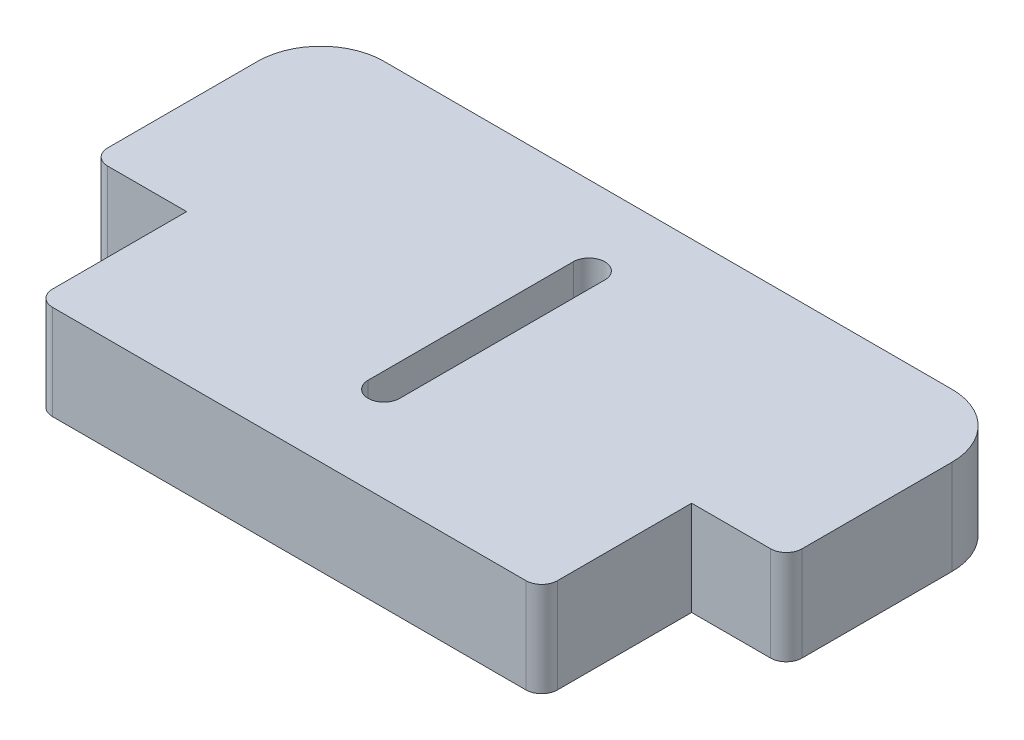
ISO-10303-21;
HEADER;
FILE_DESCRIPTION(('STEP AP214'),'2;1');
FILE_NAME('part.step','',(''),(''),'','','');
FILE_SCHEMA(('AUTOMOTIVE_DESIGN { 1 0 10303 214 1 1 1 1 }'));
ENDSEC;
DATA;
#1=APPLICATION_CONTEXT('core data for automotive mechanical design processes');
#2=APPLICATION_PROTOCOL_DEFINITION('international standard','automotive_design',2000,#1);
#3=PRODUCT_CONTEXT('',#1,'mechanical');
#4=PRODUCT('Part','Part','',(#3));
#5=PRODUCT_RELATED_PRODUCT_CATEGORY('part','',(#4));
#6=PRODUCT_DEFINITION_FORMATION('','',#4);
#7=PRODUCT_DEFINITION_CONTEXT('part definition',#1,'design');
#8=PRODUCT_DEFINITION('design','',#6,#7);
#9=PRODUCT_DEFINITION_SHAPE('','',#8);
#10=(LENGTH_UNIT() NAMED_UNIT(*) SI_UNIT(.MILLI.,.METRE.));
#11=(NAMED_UNIT(*) PLANE_ANGLE_UNIT() SI_UNIT($,.RADIAN.));
#12=(NAMED_UNIT(*) SI_UNIT($,.STERADIAN.) SOLID_ANGLE_UNIT());
#13=UNCERTAINTY_MEASURE_WITH_UNIT(LENGTH_MEASURE(1.E-05),#10,'distance_accuracy_value','');
#14=(GEOMETRIC_REPRESENTATION_CONTEXT(3) GLOBAL_UNCERTAINTY_ASSIGNED_CONTEXT((#13)) GLOBAL_UNIT_ASSIGNED_CONTEXT((#10,
#11,#12)) REPRESENTATION_CONTEXT('',''));
#15=CARTESIAN_POINT('',(0.,0.,0.));
#16=DIRECTION('',(0.,0.,1.));
#17=DIRECTION('',(1.,0.,0.));
#18=AXIS2_PLACEMENT_3D('',#15,#16,#17);
#19=CARTESIAN_POINT('',(0.,3.,-95.6317273998484));
#20=DIRECTION('',(0.,0.,1.));
#21=DIRECTION('',(1.,0.,0.));
#22=AXIS2_PLACEMENT_3D('',#19,#20,#21);
#23=PLANE('',#22);
#24=DIRECTION('',(-1.,0.,0.));
#25=VECTOR('',#24,1.);
#26=CARTESIAN_POINT('',(0.,3.,-95.6317273998484));
#27=LINE('',#26,#25);
#28=CARTESIAN_POINT('',(0.555255474952938,3.,-95.6317273998484));
#29=VERTEX_POINT('',#28);
#30=CARTESIAN_POINT('',(-1.94474452504942,3.,-95.6317273998484));
#31=VERTEX_POINT('',#30);
#32=EDGE_CURVE('E211',#29,#31,#27,.T.);
#33=ORIENTED_EDGE('',*,*,#32,.T.);
#34=DIRECTION('',(0.,-1.,0.));
#35=VECTOR('',#34,1.);
#36=CARTESIAN_POINT('',(-1.94474452504942,3.,-95.6317273998484));
#37=LINE('',#36,#35);
#38=CARTESIAN_POINT('',(-1.94474452504942,0.,-95.6317273998484));
#39=VERTEX_POINT('',#38);
#40=EDGE_CURVE('E320',#31,#39,#37,.T.);
#41=ORIENTED_EDGE('',*,*,#40,.T.);
#42=DIRECTION('',(-1.,0.,0.));
#43=VECTOR('',#42,1.);
#44=CARTESIAN_POINT('',(0.,0.,-95.6317273998484));
#45=LINE('',#44,#43);
#46=CARTESIAN_POINT('',(0.555255474952938,0.,-95.6317273998484));
#47=VERTEX_POINT('',#46);
#48=EDGE_CURVE('E253',#47,#39,#45,.T.);
#49=ORIENTED_EDGE('',*,*,#48,.F.);
#50=DIRECTION('',(0.,-1.,0.));
#51=VECTOR('',#50,1.);
#52=CARTESIAN_POINT('',(0.555255474952938,3.,-95.6317273998484));
#53=LINE('',#52,#51);
#54=EDGE_CURVE('E282',#29,#47,#53,.T.);
#55=ORIENTED_EDGE('',*,*,#54,.F.);
#56=EDGE_LOOP('',(#33,#41,#49,#55));
#57=FACE_BOUND('',#56,.T.);
#58=ADVANCED_FACE('F45',(#57),#23,.T.);
#59=CARTESIAN_POINT('',(0.555255474952947,3.,0.));
#60=DIRECTION('',(1.,0.,0.));
#61=DIRECTION('',(0.,0.,-1.));
#62=AXIS2_PLACEMENT_3D('',#59,#60,#61);
#63=PLANE('',#62);
#64=DIRECTION('',(0.,0.,1.));
#65=VECTOR('',#64,1.);
#66=CARTESIAN_POINT('',(0.555255474952947,0.,0.));
#67=LINE('',#66,#65);
#68=CARTESIAN_POINT('',(0.555255474952938,0.,-91.3817273998484));
#69=VERTEX_POINT('',#68);
#70=EDGE_CURVE('E257',#47,#69,#67,.T.);
#71=ORIENTED_EDGE('',*,*,#70,.T.);
#72=DIRECTION('',(0.,-1.,0.));
#73=VECTOR('',#72,1.);
#74=CARTESIAN_POINT('',(0.555255474952938,3.,-91.3817273998484));
#75=LINE('',#74,#73);
#76=CARTESIAN_POINT('',(0.555255474952938,3.,-91.3817273998484));
#77=VERTEX_POINT('',#76);
#78=EDGE_CURVE('E11',#69,#77,#75,.F.);
#79=ORIENTED_EDGE('',*,*,#78,.T.);
#80=DIRECTION('',(0.,0.,1.));
#81=VECTOR('',#80,1.);
#82=CARTESIAN_POINT('',(0.555255474952947,3.,0.));
#83=LINE('',#82,#81);
#84=EDGE_CURVE('E215',#29,#77,#83,.T.);
#85=ORIENTED_EDGE('',*,*,#84,.F.);
#86=ORIENTED_EDGE('',*,*,#54,.T.);
#87=EDGE_LOOP('',(#71,#79,#85,#86));
#88=FACE_BOUND('',#87,.T.);
#89=ADVANCED_FACE('F417',(#88),#63,.F.);
#90=CARTESIAN_POINT('',(0.,3.,-90.8817273998484));
#91=DIRECTION('',(0.,0.,1.));
#92=DIRECTION('',(1.,0.,0.));
#93=AXIS2_PLACEMENT_3D('',#90,#91,#92);
#94=PLANE('',#93);
#95=DIRECTION('',(-1.,0.,0.));
#96=VECTOR('',#95,1.);
#97=CARTESIAN_POINT('',(0.,0.,-90.8817273998484));
#98=LINE('',#97,#96);
#99=CARTESIAN_POINT('',(16.0552554749529,0.,-90.8817273998484));
#100=VERTEX_POINT('',#99);
#101=CARTESIAN_POINT('',(1.05525547495294,0.,-90.8817273998484));
#102=VERTEX_POINT('',#101);
#103=EDGE_CURVE('E261',#100,#102,#98,.T.);
#104=ORIENTED_EDGE('',*,*,#103,.F.);
#105=DIRECTION('',(0.,-1.,0.));
#106=VECTOR('',#105,1.);
#107=CARTESIAN_POINT('',(16.0552554749529,3.,-90.8817273998484));
#108=LINE('',#107,#106);
#109=CARTESIAN_POINT('',(16.0552554749529,3.,-90.8817273998484));
#110=VERTEX_POINT('',#109);
#111=EDGE_CURVE('E54',#100,#110,#108,.F.);
#112=ORIENTED_EDGE('',*,*,#111,.T.);
#113=DIRECTION('',(-1.,0.,0.));
#114=VECTOR('',#113,1.);
#115=CARTESIAN_POINT('',(0.,3.,-90.8817273998484));
#116=LINE('',#115,#114);
#117=CARTESIAN_POINT('',(1.05525547495294,3.,-90.8817273998484));
#118=VERTEX_POINT('',#117);
#119=EDGE_CURVE('E219',#110,#118,#116,.T.);
#120=ORIENTED_EDGE('',*,*,#119,.T.);
#121=DIRECTION('',(0.,-1.,0.));
#122=VECTOR('',#121,1.);
#123=CARTESIAN_POINT('',(1.05525547495294,0.,-90.8817273998484));
#124=LINE('',#123,#122);
#125=EDGE_CURVE('E360',#118,#102,#124,.T.);
#126=ORIENTED_EDGE('',*,*,#125,.T.);
#127=EDGE_LOOP('',(#104,#112,#120,#126));
#128=FACE_BOUND('',#127,.T.);
#129=ADVANCED_FACE('F367',(#128),#94,.T.);
#130=CARTESIAN_POINT('',(16.5552554749529,3.,0.));
#131=DIRECTION('',(1.,0.,0.));
#132=DIRECTION('',(0.,0.,-1.));
#133=AXIS2_PLACEMENT_3D('',#130,#131,#132);
#134=PLANE('',#133);
#135=DIRECTION('',(0.,0.,1.));
#136=VECTOR('',#135,1.);
#137=CARTESIAN_POINT('',(16.5552554749529,3.,0.));
#138=LINE('',#137,#136);
#139=CARTESIAN_POINT('',(16.5552554749529,3.,-95.6317273998484));
#140=VERTEX_POINT('',#139);
#141=CARTESIAN_POINT('',(16.5552554749529,3.,-91.3817273998484));
#142=VERTEX_POINT('',#141);
#143=EDGE_CURVE('E223',#140,#142,#138,.T.);
#144=ORIENTED_EDGE('',*,*,#143,.T.);
#145=DIRECTION('',(0.,-1.,0.));
#146=VECTOR('',#145,1.);
#147=CARTESIAN_POINT('',(16.5552554749529,3.,-91.3817273998484));
#148=LINE('',#147,#146);
#149=CARTESIAN_POINT('',(16.5552554749529,0.,-91.3817273998484));
#150=VERTEX_POINT('',#149);
#151=EDGE_CURVE('E356',#142,#150,#148,.T.);
#152=ORIENTED_EDGE('',*,*,#151,.T.);
#153=DIRECTION('',(0.,0.,1.));
#154=VECTOR('',#153,1.);
#155=CARTESIAN_POINT('',(16.5552554749529,0.,0.));
#156=LINE('',#155,#154);
#157=CARTESIAN_POINT('',(16.5552554749529,0.,-95.6317273998484));
#158=VERTEX_POINT('',#157);
#159=EDGE_CURVE('E265',#158,#150,#156,.T.);
#160=ORIENTED_EDGE('',*,*,#159,.F.);
#161=DIRECTION('',(0.,-1.,0.));
#162=VECTOR('',#161,1.);
#163=CARTESIAN_POINT('',(16.5552554749529,3.,-95.6317273998484));
#164=LINE('',#163,#162);
#165=EDGE_CURVE('E185',#140,#158,#164,.T.);
#166=ORIENTED_EDGE('',*,*,#165,.F.);
#167=EDGE_LOOP('',(#144,#152,#160,#166));
#168=FACE_BOUND('',#167,.T.);
#169=ADVANCED_FACE('F376',(#168),#134,.T.);
#170=CARTESIAN_POINT('',(0.,3.,-95.6317273998484));
#171=DIRECTION('',(0.,0.,-1.));
#172=DIRECTION('',(-1.,0.,0.));
#173=AXIS2_PLACEMENT_3D('',#170,#171,#172);
#174=PLANE('',#173);
#175=DIRECTION('',(1.,0.,0.));
#176=VECTOR('',#175,1.);
#177=CARTESIAN_POINT('',(0.,0.,-95.6317273998484));
#178=LINE('',#177,#176);
#179=CARTESIAN_POINT('',(19.0552554749506,0.,-95.6317273998484));
#180=VERTEX_POINT('',#179);
#181=EDGE_CURVE('E269',#158,#180,#178,.T.);
#182=ORIENTED_EDGE('',*,*,#181,.T.);
#183=DIRECTION('',(0.,-1.,0.));
#184=VECTOR('',#183,1.);
#185=CARTESIAN_POINT('',(19.0552554749506,3.,-95.6317273998484));
#186=LINE('',#185,#184);
#187=CARTESIAN_POINT('',(19.0552554749506,3.,-95.6317273998484));
#188=VERTEX_POINT('',#187);
#189=EDGE_CURVE('E61',#180,#188,#186,.F.);
#190=ORIENTED_EDGE('',*,*,#189,.T.);
#191=DIRECTION('',(1.,0.,0.));
#192=VECTOR('',#191,1.);
#193=CARTESIAN_POINT('',(0.,3.,-95.6317273998484));
#194=LINE('',#193,#192);
#195=EDGE_CURVE('E226',#140,#188,#194,.T.);
#196=ORIENTED_EDGE('',*,*,#195,.F.);
#197=ORIENTED_EDGE('',*,*,#165,.T.);
#198=EDGE_LOOP('',(#182,#190,#196,#197));
#199=FACE_BOUND('',#198,.T.);
#200=ADVANCED_FACE('F381',(#199),#174,.F.);
#201=CARTESIAN_POINT('',(19.5552554749506,3.,0.));
#202=DIRECTION('',(-1.,0.,0.));
#203=DIRECTION('',(0.,0.,1.));
#204=AXIS2_PLACEMENT_3D('',#201,#202,#203);
#205=PLANE('',#204);
#206=DIRECTION('',(0.,0.,-1.));
#207=VECTOR('',#206,1.);
#208=CARTESIAN_POINT('',(19.5552554749506,3.,0.));
#209=LINE('',#208,#207);
#210=CARTESIAN_POINT('',(19.5552554749506,3.,-96.1317273998484));
#211=VERTEX_POINT('',#210);
#212=CARTESIAN_POINT('',(19.5552554749506,3.,-100.881727399848));
#213=VERTEX_POINT('',#212);
#214=EDGE_CURVE('E229',#211,#213,#209,.T.);
#215=ORIENTED_EDGE('',*,*,#214,.F.);
#216=DIRECTION('',(0.,-1.,0.));
#217=VECTOR('',#216,1.);
#218=CARTESIAN_POINT('',(19.5552554749506,3.,-96.1317273998484));
#219=LINE('',#218,#217);
#220=CARTESIAN_POINT('',(19.5552554749506,0.,-96.1317273998484));
#221=VERTEX_POINT('',#220);
#222=EDGE_CURVE('E350',#211,#221,#219,.T.);
#223=ORIENTED_EDGE('',*,*,#222,.T.);
#224=DIRECTION('',(0.,0.,-1.));
#225=VECTOR('',#224,1.);
#226=CARTESIAN_POINT('',(19.5552554749506,0.,0.));
#227=LINE('',#226,#225);
#228=CARTESIAN_POINT('',(19.5552554749506,0.,-100.881727399848));
#229=VERTEX_POINT('',#228);
#230=EDGE_CURVE('E272',#221,#229,#227,.T.);
#231=ORIENTED_EDGE('',*,*,#230,.T.);
#232=DIRECTION('',(0.,-1.,0.));
#233=VECTOR('',#232,1.);
#234=CARTESIAN_POINT('',(19.5552554749506,3.,-100.881727399848));
#235=LINE('',#234,#233);
#236=EDGE_CURVE('E306',#229,#213,#235,.F.);
#237=ORIENTED_EDGE('',*,*,#236,.T.);
#238=EDGE_LOOP('',(#215,#223,#231,#237));
#239=FACE_BOUND('',#238,.T.);
#240=ADVANCED_FACE('F388',(#239),#205,.F.);
#241=CARTESIAN_POINT('',(0.,3.,-102.881727399848));
#242=DIRECTION('',(0.,0.,1.));
#243=DIRECTION('',(1.,0.,0.));
#244=AXIS2_PLACEMENT_3D('',#241,#242,#243);
#245=PLANE('',#244);
#246=DIRECTION('',(-1.,0.,0.));
#247=VECTOR('',#246,1.);
#248=CARTESIAN_POINT('',(0.,3.,-102.881727399848));
#249=LINE('',#248,#247);
#250=CARTESIAN_POINT('',(17.5552554749506,3.,-102.881727399848));
#251=VERTEX_POINT('',#250);
#252=CARTESIAN_POINT('',(-0.444744525049419,3.,-102.881727399848));
#253=VERTEX_POINT('',#252);
#254=EDGE_CURVE('E232',#251,#253,#249,.T.);
#255=ORIENTED_EDGE('',*,*,#254,.F.);
#256=DIRECTION('',(0.,-1.,0.));
#257=VECTOR('',#256,1.);
#258=CARTESIAN_POINT('',(17.5552554749506,3.,-102.881727399848));
#259=LINE('',#258,#257);
#260=CARTESIAN_POINT('',(17.5552554749506,0.,-102.881727399848));
#261=VERTEX_POINT('',#260);
#262=EDGE_CURVE('E295',#251,#261,#259,.T.);
#263=ORIENTED_EDGE('',*,*,#262,.T.);
#264=DIRECTION('',(-1.,0.,0.));
#265=VECTOR('',#264,1.);
#266=CARTESIAN_POINT('',(0.,0.,-102.881727399848));
#267=LINE('',#266,#265);
#268=CARTESIAN_POINT('',(-0.444744525049419,0.,-102.881727399848));
#269=VERTEX_POINT('',#268);
#270=EDGE_CURVE('E275',#261,#269,#267,.T.);
#271=ORIENTED_EDGE('',*,*,#270,.T.);
#272=DIRECTION('',(0.,-1.,0.));
#273=VECTOR('',#272,1.);
#274=CARTESIAN_POINT('',(-0.444744525049419,3.,-102.881727399848));
#275=LINE('',#274,#273);
#276=EDGE_CURVE('E285',#269,#253,#275,.F.);
#277=ORIENTED_EDGE('',*,*,#276,.T.);
#278=EDGE_LOOP('',(#255,#263,#271,#277));
#279=FACE_BOUND('',#278,.T.);
#280=ADVANCED_FACE('F397',(#279),#245,.F.);
#281=CARTESIAN_POINT('',(8.55525547495058,3.,-93.8817273998484));
#282=DIRECTION('',(0.,-1.,0.));
#283=DIRECTION('',(0.,0.,-1.));
#284=AXIS2_PLACEMENT_3D('',#281,#282,#283);
#285=CYLINDRICAL_SURFACE('',#284,0.5);
#286=CARTESIAN_POINT('',(8.55525547495058,0.,-93.8817273998484));
#287=DIRECTION('',(0.,1.,0.));
#288=DIRECTION('',(0.,0.,1.));
#289=AXIS2_PLACEMENT_3D('',#286,#287,#288);
#290=CIRCLE('',#289,0.5);
#291=CARTESIAN_POINT('',(8.05525547495058,0.,-93.8817273998484));
#292=VERTEX_POINT('',#291);
#293=CARTESIAN_POINT('',(9.05525547495058,0.,-93.8817273998484));
#294=VERTEX_POINT('',#293);
#295=EDGE_CURVE('E179',#292,#294,#290,.T.);
#296=ORIENTED_EDGE('',*,*,#295,.F.);
#297=DIRECTION('',(0.,-1.,0.));
#298=VECTOR('',#297,1.);
#299=CARTESIAN_POINT('',(8.05525547495058,3.,-93.8817273998484));
#300=LINE('',#299,#298);
#301=CARTESIAN_POINT('',(8.05525547495058,3.,-93.8817273998484));
#302=VERTEX_POINT('',#301);
#303=EDGE_CURVE('E174',#302,#292,#300,.T.);
#304=ORIENTED_EDGE('',*,*,#303,.F.);
#305=CARTESIAN_POINT('',(8.55525547495058,3.,-93.8817273998484));
#306=DIRECTION('',(0.,1.,0.));
#307=DIRECTION('',(0.,0.,1.));
#308=AXIS2_PLACEMENT_3D('',#305,#306,#307);
#309=CIRCLE('',#308,0.5);
#310=CARTESIAN_POINT('',(9.05525547495058,3.,-93.8817273998484));
#311=VERTEX_POINT('',#310);
#312=EDGE_CURVE('E177',#302,#311,#309,.T.);
#313=ORIENTED_EDGE('',*,*,#312,.T.);
#314=DIRECTION('',(0.,-1.,0.));
#315=VECTOR('',#314,1.);
#316=CARTESIAN_POINT('',(9.05525547495058,3.,-93.8817273998484));
#317=LINE('',#316,#315);
#318=EDGE_CURVE('E239',#311,#294,#317,.T.);
#319=ORIENTED_EDGE('',*,*,#318,.T.);
#320=EDGE_LOOP('',(#296,#304,#313,#319));
#321=FACE_BOUND('',#320,.T.);
#322=ADVANCED_FACE('F176',(#321),#285,.F.);
#323=CARTESIAN_POINT('',(8.0552554749506,3.,0.));
#324=DIRECTION('',(1.,0.,0.));
#325=DIRECTION('',(0.,0.,-1.));
#326=AXIS2_PLACEMENT_3D('',#323,#324,#325);
#327=PLANE('',#326);
#328=DIRECTION('',(0.,0.,1.));
#329=VECTOR('',#328,1.);
#330=CARTESIAN_POINT('',(8.0552554749506,0.,0.));
#331=LINE('',#330,#329);
#332=CARTESIAN_POINT('',(8.05525547495058,0.,-100.381727399848));
#333=VERTEX_POINT('',#332);
#334=EDGE_CURVE('E242',#333,#292,#331,.T.);
#335=ORIENTED_EDGE('',*,*,#334,.F.);
#336=DIRECTION('',(0.,-1.,0.));
#337=VECTOR('',#336,1.);
#338=CARTESIAN_POINT('',(8.05525547495058,3.,-100.381727399848));
#339=LINE('',#338,#337);
#340=CARTESIAN_POINT('',(8.05525547495058,3.,-100.381727399848));
#341=VERTEX_POINT('',#340);
#342=EDGE_CURVE('E186',#341,#333,#339,.T.);
#343=ORIENTED_EDGE('',*,*,#342,.F.);
#344=DIRECTION('',(0.,0.,1.));
#345=VECTOR('',#344,1.);
#346=CARTESIAN_POINT('',(8.0552554749506,3.,0.));
#347=LINE('',#346,#345);
#348=EDGE_CURVE('E192',#341,#302,#347,.T.);
#349=ORIENTED_EDGE('',*,*,#348,.T.);
#350=ORIENTED_EDGE('',*,*,#303,.T.);
#351=EDGE_LOOP('',(#335,#343,#349,#350));
#352=FACE_BOUND('',#351,.T.);
#353=ADVANCED_FACE('F200',(#352),#327,.T.);
#354=CARTESIAN_POINT('',(8.55525547495058,3.,-100.381727399848));
#355=DIRECTION('',(0.,-1.,0.));
#356=DIRECTION('',(0.,0.,-1.));
#357=AXIS2_PLACEMENT_3D('',#354,#355,#356);
#358=CYLINDRICAL_SURFACE('',#357,0.500000000000001);
#359=CARTESIAN_POINT('',(8.55525547495058,0.,-100.381727399848));
#360=DIRECTION('',(0.,1.,0.));
#361=DIRECTION('',(0.,0.,1.));
#362=AXIS2_PLACEMENT_3D('',#359,#360,#361);
#363=CIRCLE('',#362,0.500000000000001);
#364=CARTESIAN_POINT('',(9.05525547495058,0.,-100.381727399848));
#365=VERTEX_POINT('',#364);
#366=EDGE_CURVE('E245',#365,#333,#363,.T.);
#367=ORIENTED_EDGE('',*,*,#366,.F.);
#368=DIRECTION('',(0.,-1.,0.));
#369=VECTOR('',#368,1.);
#370=CARTESIAN_POINT('',(9.05525547495058,3.,-100.381727399848));
#371=LINE('',#370,#369);
#372=CARTESIAN_POINT('',(9.05525547495058,3.,-100.381727399848));
#373=VERTEX_POINT('',#372);
#374=EDGE_CURVE('E288',#373,#365,#371,.T.);
#375=ORIENTED_EDGE('',*,*,#374,.F.);
#376=CARTESIAN_POINT('',(8.55525547495058,3.,-100.381727399848));
#377=DIRECTION('',(0.,1.,0.));
#378=DIRECTION('',(0.,0.,1.));
#379=AXIS2_PLACEMENT_3D('',#376,#377,#378);
#380=CIRCLE('',#379,0.500000000000001);
#381=EDGE_CURVE('E202',#373,#341,#380,.T.);
#382=ORIENTED_EDGE('',*,*,#381,.T.);
#383=ORIENTED_EDGE('',*,*,#342,.T.);
#384=EDGE_LOOP('',(#367,#375,#382,#383));
#385=FACE_BOUND('',#384,.T.);
#386=ADVANCED_FACE('F434',(#385),#358,.F.);
#387=CARTESIAN_POINT('',(9.05525547495058,3.,0.));
#388=DIRECTION('',(1.,0.,0.));
#389=DIRECTION('',(0.,0.,-1.));
#390=AXIS2_PLACEMENT_3D('',#387,#388,#389);
#391=PLANE('',#390);
#392=DIRECTION('',(0.,0.,1.));
#393=VECTOR('',#392,1.);
#394=CARTESIAN_POINT('',(9.05525547495058,0.,0.));
#395=LINE('',#394,#393);
#396=EDGE_CURVE('E249',#365,#294,#395,.T.);
#397=ORIENTED_EDGE('',*,*,#396,.T.);
#398=ORIENTED_EDGE('',*,*,#318,.F.);
#399=DIRECTION('',(0.,0.,1.));
#400=VECTOR('',#399,1.);
#401=CARTESIAN_POINT('',(9.05525547495058,3.,0.));
#402=LINE('',#401,#400);
#403=EDGE_CURVE('E195',#373,#311,#402,.T.);
#404=ORIENTED_EDGE('',*,*,#403,.F.);
#405=ORIENTED_EDGE('',*,*,#374,.T.);
#406=EDGE_LOOP('',(#397,#398,#404,#405));
#407=FACE_BOUND('',#406,.T.);
#408=ADVANCED_FACE('F430',(#407),#391,.F.);
#409=CARTESIAN_POINT('',(-2.44474452504942,3.,0.));
#410=DIRECTION('',(-1.,0.,0.));
#411=DIRECTION('',(0.,0.,1.));
#412=AXIS2_PLACEMENT_3D('',#409,#410,#411);
#413=PLANE('',#412);
#414=DIRECTION('',(0.,0.,-1.));
#415=VECTOR('',#414,1.);
#416=CARTESIAN_POINT('',(-2.44474452504942,0.,0.));
#417=LINE('',#416,#415);
#418=CARTESIAN_POINT('',(-2.44474452504942,0.,-96.1317273998484));
#419=VERTEX_POINT('',#418);
#420=CARTESIAN_POINT('',(-2.44474452504942,0.,-100.881727399848));
#421=VERTEX_POINT('',#420);
#422=EDGE_CURVE('E198',#419,#421,#417,.T.);
#423=ORIENTED_EDGE('',*,*,#422,.F.);
#424=DIRECTION('',(0.,-1.,0.));
#425=VECTOR('',#424,1.);
#426=CARTESIAN_POINT('',(-2.44474452504942,3.,-96.1317273998484));
#427=LINE('',#426,#425);
#428=CARTESIAN_POINT('',(-2.44474452504942,3.,-96.1317273998484));
#429=VERTEX_POINT('',#428);
#430=EDGE_CURVE('E336',#419,#429,#427,.F.);
#431=ORIENTED_EDGE('',*,*,#430,.T.);
#432=DIRECTION('',(0.,0.,-1.));
#433=VECTOR('',#432,1.);
#434=CARTESIAN_POINT('',(-2.44474452504942,3.,0.));
#435=LINE('',#434,#433);
#436=CARTESIAN_POINT('',(-2.44474452504942,3.,-100.881727399848));
#437=VERTEX_POINT('',#436);
#438=EDGE_CURVE('E236',#429,#437,#435,.T.);
#439=ORIENTED_EDGE('',*,*,#438,.T.);
#440=DIRECTION('',(0.,-1.,0.));
#441=VECTOR('',#440,1.);
#442=CARTESIAN_POINT('',(-2.44474452504942,0.,-100.881727399848));
#443=LINE('',#442,#441);
#444=EDGE_CURVE('E316',#437,#421,#443,.T.);
#445=ORIENTED_EDGE('',*,*,#444,.T.);
#446=EDGE_LOOP('',(#423,#431,#439,#445));
#447=FACE_BOUND('',#446,.T.);
#448=ADVANCED_FACE('F433',(#447),#413,.T.);
#449=CARTESIAN_POINT('',(0.,3.,0.));
#450=DIRECTION('',(0.,1.,0.));
#451=DIRECTION('',(0.,0.,1.));
#452=AXIS2_PLACEMENT_3D('',#449,#450,#451);
#453=PLANE('',#452);
#454=ORIENTED_EDGE('',*,*,#312,.F.);
#455=ORIENTED_EDGE('',*,*,#348,.F.);
#456=ORIENTED_EDGE('',*,*,#381,.F.);
#457=ORIENTED_EDGE('',*,*,#403,.T.);
#458=EDGE_LOOP('',(#454,#455,#456,#457));
#459=FACE_BOUND('',#458,.T.);
#460=ORIENTED_EDGE('',*,*,#438,.F.);
#461=CARTESIAN_POINT('',(-1.94474452504942,3.,-96.1317273998484));
#462=DIRECTION('',(0.,1.,0.));
#463=DIRECTION('',(0.,0.,1.));
#464=AXIS2_PLACEMENT_3D('',#461,#462,#463);
#465=CIRCLE('',#464,0.5);
#466=EDGE_CURVE('E347',#429,#31,#465,.T.);
#467=ORIENTED_EDGE('',*,*,#466,.T.);
#468=ORIENTED_EDGE('',*,*,#32,.F.);
#469=ORIENTED_EDGE('',*,*,#84,.T.);
#470=CARTESIAN_POINT('',(1.05525547495294,3.,-91.3817273998484));
#471=DIRECTION('',(0.,1.,0.));
#472=DIRECTION('',(0.,0.,1.));
#473=AXIS2_PLACEMENT_3D('',#470,#471,#472);
#474=CIRCLE('',#473,0.5);
#475=EDGE_CURVE('E339',#77,#118,#474,.T.);
#476=ORIENTED_EDGE('',*,*,#475,.T.);
#477=ORIENTED_EDGE('',*,*,#119,.F.);
#478=CARTESIAN_POINT('',(16.0552554749529,3.,-91.3817273998484));
#479=DIRECTION('',(0.,1.,0.));
#480=DIRECTION('',(0.,0.,1.));
#481=AXIS2_PLACEMENT_3D('',#478,#479,#480);
#482=CIRCLE('',#481,0.5);
#483=EDGE_CURVE('E69',#110,#142,#482,.T.);
#484=ORIENTED_EDGE('',*,*,#483,.T.);
#485=ORIENTED_EDGE('',*,*,#143,.F.);
#486=ORIENTED_EDGE('',*,*,#195,.T.);
#487=CARTESIAN_POINT('',(19.0552554749506,3.,-96.1317273998484));
#488=DIRECTION('',(0.,1.,0.));
#489=DIRECTION('',(0.,0.,1.));
#490=AXIS2_PLACEMENT_3D('',#487,#488,#489);
#491=CIRCLE('',#490,0.5);
#492=EDGE_CURVE('E344',#188,#211,#491,.T.);
#493=ORIENTED_EDGE('',*,*,#492,.T.);
#494=ORIENTED_EDGE('',*,*,#214,.T.);
#495=CARTESIAN_POINT('',(17.5552554749506,3.,-100.881727399848));
#496=DIRECTION('',(0.,1.,0.));
#497=DIRECTION('',(0.,0.,1.));
#498=AXIS2_PLACEMENT_3D('',#495,#496,#497);
#499=CIRCLE('',#498,2.);
#500=EDGE_CURVE('E314',#213,#251,#499,.T.);
#501=ORIENTED_EDGE('',*,*,#500,.T.);
#502=ORIENTED_EDGE('',*,*,#254,.T.);
#503=CARTESIAN_POINT('',(-0.444744525049419,3.,-100.881727399848));
#504=DIRECTION('',(0.,1.,0.));
#505=DIRECTION('',(0.,0.,1.));
#506=AXIS2_PLACEMENT_3D('',#503,#504,#505);
#507=CIRCLE('',#506,2.);
#508=EDGE_CURVE('E310',#253,#437,#507,.T.);
#509=ORIENTED_EDGE('',*,*,#508,.T.);
#510=EDGE_LOOP('',(#460,#467,#468,#469,#476,#477,#484,#485,#486,#493,#494,#501,#502,#509));
#511=FACE_BOUND('',#510,.T.);
#512=ADVANCED_FACE('F190',(#459,#511),#453,.T.);
#513=CARTESIAN_POINT('',(0.,0.,0.));
#514=DIRECTION('',(0.,1.,0.));
#515=DIRECTION('',(0.,0.,1.));
#516=AXIS2_PLACEMENT_3D('',#513,#514,#515);
#517=PLANE('',#516);
#518=ORIENTED_EDGE('',*,*,#295,.T.);
#519=ORIENTED_EDGE('',*,*,#396,.F.);
#520=ORIENTED_EDGE('',*,*,#366,.T.);
#521=ORIENTED_EDGE('',*,*,#334,.T.);
#522=EDGE_LOOP('',(#518,#519,#520,#521));
#523=FACE_BOUND('',#522,.T.);
#524=ORIENTED_EDGE('',*,*,#48,.T.);
#525=CARTESIAN_POINT('',(-1.94474452504942,0.,-96.1317273998484));
#526=DIRECTION('',(0.,1.,0.));
#527=DIRECTION('',(0.,0.,1.));
#528=AXIS2_PLACEMENT_3D('',#525,#526,#527);
#529=CIRCLE('',#528,0.5);
#530=EDGE_CURVE('E333',#39,#419,#529,.F.);
#531=ORIENTED_EDGE('',*,*,#530,.T.);
#532=ORIENTED_EDGE('',*,*,#422,.T.);
#533=CARTESIAN_POINT('',(-0.444744525049419,0.,-100.881727399848));
#534=DIRECTION('',(0.,1.,0.));
#535=DIRECTION('',(0.,0.,1.));
#536=AXIS2_PLACEMENT_3D('',#533,#534,#535);
#537=CIRCLE('',#536,2.);
#538=EDGE_CURVE('E299',#421,#269,#537,.F.);
#539=ORIENTED_EDGE('',*,*,#538,.T.);
#540=ORIENTED_EDGE('',*,*,#270,.F.);
#541=CARTESIAN_POINT('',(17.5552554749506,0.,-100.881727399848));
#542=DIRECTION('',(0.,1.,0.));
#543=DIRECTION('',(0.,0.,1.));
#544=AXIS2_PLACEMENT_3D('',#541,#542,#543);
#545=CIRCLE('',#544,2.);
#546=EDGE_CURVE('E302',#261,#229,#545,.F.);
#547=ORIENTED_EDGE('',*,*,#546,.T.);
#548=ORIENTED_EDGE('',*,*,#230,.F.);
#549=CARTESIAN_POINT('',(19.0552554749506,0.,-96.1317273998484));
#550=DIRECTION('',(0.,1.,0.));
#551=DIRECTION('',(0.,0.,1.));
#552=AXIS2_PLACEMENT_3D('',#549,#550,#551);
#553=CIRCLE('',#552,0.5);
#554=EDGE_CURVE('E330',#221,#180,#553,.F.);
#555=ORIENTED_EDGE('',*,*,#554,.T.);
#556=ORIENTED_EDGE('',*,*,#181,.F.);
#557=ORIENTED_EDGE('',*,*,#159,.T.);
#558=CARTESIAN_POINT('',(16.0552554749529,0.,-91.3817273998484));
#559=DIRECTION('',(0.,1.,0.));
#560=DIRECTION('',(0.,0.,1.));
#561=AXIS2_PLACEMENT_3D('',#558,#559,#560);
#562=CIRCLE('',#561,0.5);
#563=EDGE_CURVE('E327',#150,#100,#562,.F.);
#564=ORIENTED_EDGE('',*,*,#563,.T.);
#565=ORIENTED_EDGE('',*,*,#103,.T.);
#566=CARTESIAN_POINT('',(1.05525547495294,0.,-91.3817273998484));
#567=DIRECTION('',(0.,1.,0.));
#568=DIRECTION('',(0.,0.,1.));
#569=AXIS2_PLACEMENT_3D('',#566,#567,#568);
#570=CIRCLE('',#569,0.5);
#571=EDGE_CURVE('E324',#102,#69,#570,.F.);
#572=ORIENTED_EDGE('',*,*,#571,.T.);
#573=ORIENTED_EDGE('',*,*,#70,.F.);
#574=EDGE_LOOP('',(#524,#531,#532,#539,#540,#547,#548,#555,#556,#557,#564,#565,#572,#573));
#575=FACE_BOUND('',#574,.T.);
#576=ADVANCED_FACE('F379',(#523,#575),#517,.F.);
#577=CARTESIAN_POINT('',(17.5552554749506,3.,-100.881727399848));
#578=DIRECTION('',(0.,-1.,0.));
#579=DIRECTION('',(0.,0.,-1.));
#580=AXIS2_PLACEMENT_3D('',#577,#578,#579);
#581=CYLINDRICAL_SURFACE('',#580,2.);
#582=ORIENTED_EDGE('',*,*,#500,.F.);
#583=ORIENTED_EDGE('',*,*,#236,.F.);
#584=ORIENTED_EDGE('',*,*,#546,.F.);
#585=ORIENTED_EDGE('',*,*,#262,.F.);
#586=EDGE_LOOP('',(#582,#583,#584,#585));
#587=FACE_BOUND('',#586,.T.);
#588=ADVANCED_FACE('F393',(#587),#581,.T.);
#589=CARTESIAN_POINT('',(-0.444744525049419,3.,-100.881727399848));
#590=DIRECTION('',(0.,1.,0.));
#591=DIRECTION('',(0.,0.,1.));
#592=AXIS2_PLACEMENT_3D('',#589,#590,#591);
#593=CYLINDRICAL_SURFACE('',#592,2.);
#594=ORIENTED_EDGE('',*,*,#508,.F.);
#595=ORIENTED_EDGE('',*,*,#276,.F.);
#596=ORIENTED_EDGE('',*,*,#538,.F.);
#597=ORIENTED_EDGE('',*,*,#444,.F.);
#598=EDGE_LOOP('',(#594,#595,#596,#597));
#599=FACE_BOUND('',#598,.T.);
#600=ADVANCED_FACE('F402',(#599),#593,.T.);
#601=CARTESIAN_POINT('',(-1.94474452504942,3.,-96.1317273998484));
#602=DIRECTION('',(0.,-1.,0.));
#603=DIRECTION('',(0.,0.,-1.));
#604=AXIS2_PLACEMENT_3D('',#601,#602,#603);
#605=CYLINDRICAL_SURFACE('',#604,0.5);
#606=ORIENTED_EDGE('',*,*,#466,.F.);
#607=ORIENTED_EDGE('',*,*,#430,.F.);
#608=ORIENTED_EDGE('',*,*,#530,.F.);
#609=ORIENTED_EDGE('',*,*,#40,.F.);
#610=EDGE_LOOP('',(#606,#607,#608,#609));
#611=FACE_BOUND('',#610,.T.);
#612=ADVANCED_FACE('F410',(#611),#605,.T.);
#613=CARTESIAN_POINT('',(19.0552554749506,3.,-96.1317273998484));
#614=DIRECTION('',(0.,-1.,0.));
#615=DIRECTION('',(0.,0.,-1.));
#616=AXIS2_PLACEMENT_3D('',#613,#614,#615);
#617=CYLINDRICAL_SURFACE('',#616,0.5);
#618=ORIENTED_EDGE('',*,*,#492,.F.);
#619=ORIENTED_EDGE('',*,*,#189,.F.);
#620=ORIENTED_EDGE('',*,*,#554,.F.);
#621=ORIENTED_EDGE('',*,*,#222,.F.);
#622=EDGE_LOOP('',(#618,#619,#620,#621));
#623=FACE_BOUND('',#622,.T.);
#624=ADVANCED_FACE('F384',(#623),#617,.T.);
#625=CARTESIAN_POINT('',(16.0552554749529,3.,-91.3817273998484));
#626=DIRECTION('',(0.,-1.,0.));
#627=DIRECTION('',(0.,0.,-1.));
#628=AXIS2_PLACEMENT_3D('',#625,#626,#627);
#629=CYLINDRICAL_SURFACE('',#628,0.5);
#630=ORIENTED_EDGE('',*,*,#483,.F.);
#631=ORIENTED_EDGE('',*,*,#111,.F.);
#632=ORIENTED_EDGE('',*,*,#563,.F.);
#633=ORIENTED_EDGE('',*,*,#151,.F.);
#634=EDGE_LOOP('',(#630,#631,#632,#633));
#635=FACE_BOUND('',#634,.T.);
#636=ADVANCED_FACE('F373',(#635),#629,.T.);
#637=CARTESIAN_POINT('',(1.05525547495294,3.,-91.3817273998484));
#638=DIRECTION('',(0.,1.,0.));
#639=DIRECTION('',(0.,0.,1.));
#640=AXIS2_PLACEMENT_3D('',#637,#638,#639);
#641=CYLINDRICAL_SURFACE('',#640,0.5);
#642=ORIENTED_EDGE('',*,*,#475,.F.);
#643=ORIENTED_EDGE('',*,*,#78,.F.);
#644=ORIENTED_EDGE('',*,*,#571,.F.);
#645=ORIENTED_EDGE('',*,*,#125,.F.);
#646=EDGE_LOOP('',(#642,#643,#644,#645));
#647=FACE_BOUND('',#646,.T.);
#648=ADVANCED_FACE('F47',(#647),#641,.T.);
#649=CLOSED_SHELL('',(#58,#89,#129,#169,#200,#240,#280,#322,#353,#386,#408,#448,#512,#576,#588,
#600,#612,#624,#636,#648));
#650=MANIFOLD_SOLID_BREP('B2',#649);
#651=ADVANCED_BREP_SHAPE_REPRESENTATION('',(#18,#650),#14);
#652=SHAPE_DEFINITION_REPRESENTATION(#9,#651);
ENDSEC;
END-ISO-10303-21;
